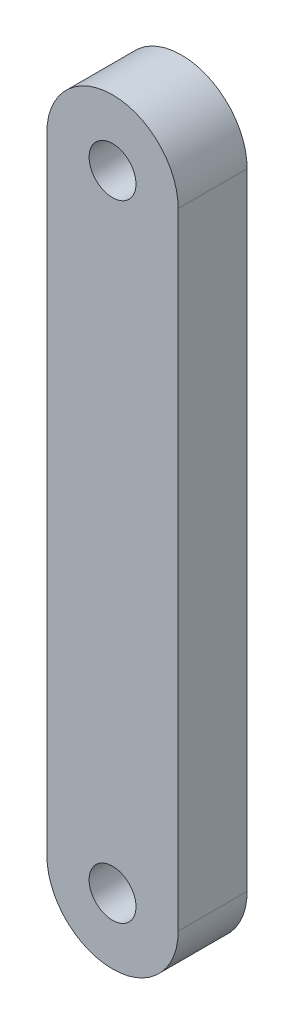
ISO-10303-21;
HEADER;
FILE_DESCRIPTION(('STEP AP214'),'2;1');
FILE_NAME('part.step','',(''),(''),'','','');
FILE_SCHEMA(('AUTOMOTIVE_DESIGN { 1 0 10303 214 1 1 1 1 }'));
ENDSEC;
DATA;
#1=APPLICATION_CONTEXT('core data for automotive mechanical design processes');
#2=APPLICATION_PROTOCOL_DEFINITION('international standard','automotive_design',2000,#1);
#3=PRODUCT_CONTEXT('',#1,'mechanical');
#4=PRODUCT('Part','Part','',(#3));
#5=PRODUCT_RELATED_PRODUCT_CATEGORY('part','',(#4));
#6=PRODUCT_DEFINITION_FORMATION('','',#4);
#7=PRODUCT_DEFINITION_CONTEXT('part definition',#1,'design');
#8=PRODUCT_DEFINITION('design','',#6,#7);
#9=PRODUCT_DEFINITION_SHAPE('','',#8);
#10=(LENGTH_UNIT() NAMED_UNIT(*) SI_UNIT(.MILLI.,.METRE.));
#11=(NAMED_UNIT(*) PLANE_ANGLE_UNIT() SI_UNIT($,.RADIAN.));
#12=(NAMED_UNIT(*) SI_UNIT($,.STERADIAN.) SOLID_ANGLE_UNIT());
#13=UNCERTAINTY_MEASURE_WITH_UNIT(LENGTH_MEASURE(1.E-05),#10,'distance_accuracy_value','');
#14=(GEOMETRIC_REPRESENTATION_CONTEXT(3) GLOBAL_UNCERTAINTY_ASSIGNED_CONTEXT((#13)) GLOBAL_UNIT_ASSIGNED_CONTEXT((#10,
#11,#12)) REPRESENTATION_CONTEXT('',''));
#15=CARTESIAN_POINT('',(0.,0.,0.));
#16=DIRECTION('',(0.,0.,1.));
#17=DIRECTION('',(1.,0.,0.));
#18=AXIS2_PLACEMENT_3D('',#15,#16,#17);
#19=CARTESIAN_POINT('',(0.,14.4838985534079,5.));
#20=DIRECTION('',(0.,0.,1.));
#21=DIRECTION('',(1.,0.,0.));
#22=AXIS2_PLACEMENT_3D('',#19,#20,#21);
#23=PLANE('',#22);
#24=CARTESIAN_POINT('',(0.,59.8656683806735,5.));
#25=DIRECTION('',(0.,0.,1.));
#26=DIRECTION('',(1.,0.,0.));
#27=AXIS2_PLACEMENT_3D('',#24,#25,#26);
#28=CIRCLE('',#27,1.7);
#29=CARTESIAN_POINT('',(1.7,59.8656683806735,5.));
#30=VERTEX_POINT('',#29);
#31=EDGE_CURVE('E121',#30,#30,#28,.T.);
#32=ORIENTED_EDGE('',*,*,#31,.F.);
#33=EDGE_LOOP('',(#32));
#34=FACE_BOUND('',#33,.T.);
#35=CARTESIAN_POINT('',(0.,14.4838985534079,5.));
#36=DIRECTION('',(0.,0.,1.));
#37=DIRECTION('',(1.,0.,0.));
#38=AXIS2_PLACEMENT_3D('',#35,#36,#37);
#39=CIRCLE('',#38,4.7623156527834);
#40=CARTESIAN_POINT('',(-4.7623156527834,14.4838985534079,5.));
#41=VERTEX_POINT('',#40);
#42=CARTESIAN_POINT('',(4.7623156527834,14.4838985534079,5.));
#43=VERTEX_POINT('',#42);
#44=EDGE_CURVE('E100',#41,#43,#39,.T.);
#45=ORIENTED_EDGE('',*,*,#44,.T.);
#46=DIRECTION('',(0.,1.,0.));
#47=VECTOR('',#46,1.);
#48=CARTESIAN_POINT('',(4.7623156527834,14.4838985534079,5.));
#49=LINE('',#48,#47);
#50=CARTESIAN_POINT('',(4.7623156527834,59.8656683806735,5.));
#51=VERTEX_POINT('',#50);
#52=EDGE_CURVE('E94',#43,#51,#49,.T.);
#53=ORIENTED_EDGE('',*,*,#52,.T.);
#54=CARTESIAN_POINT('',(0.,59.8656683806735,5.));
#55=DIRECTION('',(0.,0.,1.));
#56=DIRECTION('',(1.,0.,0.));
#57=AXIS2_PLACEMENT_3D('',#54,#55,#56);
#58=CIRCLE('',#57,4.7623156527834);
#59=CARTESIAN_POINT('',(-4.7623156527834,59.8656683806735,5.));
#60=VERTEX_POINT('',#59);
#61=EDGE_CURVE('E98',#51,#60,#58,.T.);
#62=ORIENTED_EDGE('',*,*,#61,.T.);
#63=DIRECTION('',(0.,-1.,0.));
#64=VECTOR('',#63,1.);
#65=CARTESIAN_POINT('',(-4.7623156527834,14.4838985534079,5.));
#66=LINE('',#65,#64);
#67=EDGE_CURVE('E60',#60,#41,#66,.T.);
#68=ORIENTED_EDGE('',*,*,#67,.T.);
#69=EDGE_LOOP('',(#45,#53,#62,#68));
#70=FACE_BOUND('',#69,.T.);
#71=CARTESIAN_POINT('',(0.,14.4838985534079,5.));
#72=DIRECTION('',(0.,0.,1.));
#73=DIRECTION('',(1.,0.,0.));
#74=AXIS2_PLACEMENT_3D('',#71,#72,#73);
#75=CIRCLE('',#74,1.7);
#76=CARTESIAN_POINT('',(1.7,14.4838985534079,5.));
#77=VERTEX_POINT('',#76);
#78=EDGE_CURVE('E143',#77,#77,#75,.T.);
#79=ORIENTED_EDGE('',*,*,#78,.F.);
#80=EDGE_LOOP('',(#79));
#81=FACE_BOUND('',#80,.T.);
#82=ADVANCED_FACE('F39',(#34,#70,#81),#23,.T.);
#83=CARTESIAN_POINT('',(0.,14.4838985534079,0.));
#84=DIRECTION('',(0.,0.,1.));
#85=DIRECTION('',(1.,0.,0.));
#86=AXIS2_PLACEMENT_3D('',#83,#84,#85);
#87=PLANE('',#86);
#88=CARTESIAN_POINT('',(0.,59.8656683806735,0.));
#89=DIRECTION('',(0.,0.,1.));
#90=DIRECTION('',(1.,0.,0.));
#91=AXIS2_PLACEMENT_3D('',#88,#89,#90);
#92=CIRCLE('',#91,1.7);
#93=CARTESIAN_POINT('',(1.7,59.8656683806735,0.));
#94=VERTEX_POINT('',#93);
#95=EDGE_CURVE('E140',#94,#94,#92,.T.);
#96=ORIENTED_EDGE('',*,*,#95,.T.);
#97=EDGE_LOOP('',(#96));
#98=FACE_BOUND('',#97,.T.);
#99=CARTESIAN_POINT('',(0.,14.4838985534079,0.));
#100=DIRECTION('',(0.,0.,1.));
#101=DIRECTION('',(1.,0.,0.));
#102=AXIS2_PLACEMENT_3D('',#99,#100,#101);
#103=CIRCLE('',#102,4.7623156527834);
#104=CARTESIAN_POINT('',(-4.7623156527834,14.4838985534079,0.));
#105=VERTEX_POINT('',#104);
#106=CARTESIAN_POINT('',(4.7623156527834,14.4838985534079,0.));
#107=VERTEX_POINT('',#106);
#108=EDGE_CURVE('E117',#105,#107,#103,.T.);
#109=ORIENTED_EDGE('',*,*,#108,.F.);
#110=DIRECTION('',(0.,-1.,0.));
#111=VECTOR('',#110,1.);
#112=CARTESIAN_POINT('',(-4.7623156527834,14.4838985534079,0.));
#113=LINE('',#112,#111);
#114=CARTESIAN_POINT('',(-4.7623156527834,59.8656683806735,0.));
#115=VERTEX_POINT('',#114);
#116=EDGE_CURVE('E87',#115,#105,#113,.T.);
#117=ORIENTED_EDGE('',*,*,#116,.F.);
#118=CARTESIAN_POINT('',(0.,59.8656683806735,0.));
#119=DIRECTION('',(0.,0.,1.));
#120=DIRECTION('',(1.,0.,0.));
#121=AXIS2_PLACEMENT_3D('',#118,#119,#120);
#122=CIRCLE('',#121,4.7623156527834);
#123=CARTESIAN_POINT('',(4.7623156527834,59.8656683806735,0.));
#124=VERTEX_POINT('',#123);
#125=EDGE_CURVE('E81',#124,#115,#122,.T.);
#126=ORIENTED_EDGE('',*,*,#125,.F.);
#127=DIRECTION('',(0.,1.,0.));
#128=VECTOR('',#127,1.);
#129=CARTESIAN_POINT('',(4.7623156527834,14.4838985534079,0.));
#130=LINE('',#129,#128);
#131=EDGE_CURVE('E105',#107,#124,#130,.T.);
#132=ORIENTED_EDGE('',*,*,#131,.F.);
#133=EDGE_LOOP('',(#109,#117,#126,#132));
#134=FACE_BOUND('',#133,.T.);
#135=CARTESIAN_POINT('',(0.,14.4838985534079,0.));
#136=DIRECTION('',(0.,0.,1.));
#137=DIRECTION('',(1.,0.,0.));
#138=AXIS2_PLACEMENT_3D('',#135,#136,#137);
#139=CIRCLE('',#138,1.7);
#140=CARTESIAN_POINT('',(1.7,14.4838985534079,0.));
#141=VERTEX_POINT('',#140);
#142=EDGE_CURVE('E147',#141,#141,#139,.T.);
#143=ORIENTED_EDGE('',*,*,#142,.T.);
#144=EDGE_LOOP('',(#143));
#145=FACE_BOUND('',#144,.T.);
#146=ADVANCED_FACE('F134',(#98,#134,#145),#87,.F.);
#147=CARTESIAN_POINT('',(0.,14.4838985534079,5.));
#148=DIRECTION('',(0.,0.,-1.));
#149=DIRECTION('',(-1.,0.,0.));
#150=AXIS2_PLACEMENT_3D('',#147,#148,#149);
#151=CYLINDRICAL_SURFACE('',#150,4.7623156527834);
#152=ORIENTED_EDGE('',*,*,#108,.T.);
#153=DIRECTION('',(0.,0.,-1.));
#154=VECTOR('',#153,1.);
#155=CARTESIAN_POINT('',(4.7623156527834,14.4838985534079,5.));
#156=LINE('',#155,#154);
#157=EDGE_CURVE('E11',#43,#107,#156,.T.);
#158=ORIENTED_EDGE('',*,*,#157,.F.);
#159=ORIENTED_EDGE('',*,*,#44,.F.);
#160=DIRECTION('',(0.,0.,-1.));
#161=VECTOR('',#160,1.);
#162=CARTESIAN_POINT('',(-4.7623156527834,14.4838985534079,5.));
#163=LINE('',#162,#161);
#164=EDGE_CURVE('E113',#41,#105,#163,.T.);
#165=ORIENTED_EDGE('',*,*,#164,.T.);
#166=EDGE_LOOP('',(#152,#158,#159,#165));
#167=FACE_BOUND('',#166,.T.);
#168=ADVANCED_FACE('F41',(#167),#151,.T.);
#169=CARTESIAN_POINT('',(4.7623156527834,14.4838985534079,5.));
#170=DIRECTION('',(-1.,0.,0.));
#171=DIRECTION('',(0.,0.,1.));
#172=AXIS2_PLACEMENT_3D('',#169,#170,#171);
#173=PLANE('',#172);
#174=ORIENTED_EDGE('',*,*,#131,.T.);
#175=DIRECTION('',(0.,0.,-1.));
#176=VECTOR('',#175,1.);
#177=CARTESIAN_POINT('',(4.7623156527834,59.8656683806735,5.));
#178=LINE('',#177,#176);
#179=EDGE_CURVE('E49',#51,#124,#178,.T.);
#180=ORIENTED_EDGE('',*,*,#179,.F.);
#181=ORIENTED_EDGE('',*,*,#52,.F.);
#182=ORIENTED_EDGE('',*,*,#157,.T.);
#183=EDGE_LOOP('',(#174,#180,#181,#182));
#184=FACE_BOUND('',#183,.T.);
#185=ADVANCED_FACE('F104',(#184),#173,.F.);
#186=CARTESIAN_POINT('',(0.,59.8656683806735,5.));
#187=DIRECTION('',(0.,0.,-1.));
#188=DIRECTION('',(-1.,0.,0.));
#189=AXIS2_PLACEMENT_3D('',#186,#187,#188);
#190=CYLINDRICAL_SURFACE('',#189,4.7623156527834);
#191=ORIENTED_EDGE('',*,*,#125,.T.);
#192=DIRECTION('',(0.,0.,-1.));
#193=VECTOR('',#192,1.);
#194=CARTESIAN_POINT('',(-4.7623156527834,59.8656683806735,5.));
#195=LINE('',#194,#193);
#196=EDGE_CURVE('E107',#60,#115,#195,.T.);
#197=ORIENTED_EDGE('',*,*,#196,.F.);
#198=ORIENTED_EDGE('',*,*,#61,.F.);
#199=ORIENTED_EDGE('',*,*,#179,.T.);
#200=EDGE_LOOP('',(#191,#197,#198,#199));
#201=FACE_BOUND('',#200,.T.);
#202=ADVANCED_FACE('F108',(#201),#190,.T.);
#203=CARTESIAN_POINT('',(-4.7623156527834,14.4838985534079,5.));
#204=DIRECTION('',(1.,0.,0.));
#205=DIRECTION('',(0.,0.,-1.));
#206=AXIS2_PLACEMENT_3D('',#203,#204,#205);
#207=PLANE('',#206);
#208=ORIENTED_EDGE('',*,*,#116,.T.);
#209=ORIENTED_EDGE('',*,*,#164,.F.);
#210=ORIENTED_EDGE('',*,*,#67,.F.);
#211=ORIENTED_EDGE('',*,*,#196,.T.);
#212=EDGE_LOOP('',(#208,#209,#210,#211));
#213=FACE_BOUND('',#212,.T.);
#214=ADVANCED_FACE('F131',(#213),#207,.F.);
#215=CARTESIAN_POINT('',(0.,59.8656683806735,5.));
#216=DIRECTION('',(0.,0.,-1.));
#217=DIRECTION('',(-1.,0.,0.));
#218=AXIS2_PLACEMENT_3D('',#215,#216,#217);
#219=CYLINDRICAL_SURFACE('',#218,1.7);
#220=ORIENTED_EDGE('',*,*,#31,.T.);
#221=EDGE_LOOP('',(#220));
#222=FACE_BOUND('',#221,.T.);
#223=ORIENTED_EDGE('',*,*,#95,.F.);
#224=EDGE_LOOP('',(#223));
#225=FACE_BOUND('',#224,.T.);
#226=ADVANCED_FACE('F166',(#222,#225),#219,.F.);
#227=CARTESIAN_POINT('',(0.,14.4838985534079,5.));
#228=DIRECTION('',(0.,0.,-1.));
#229=DIRECTION('',(-1.,0.,0.));
#230=AXIS2_PLACEMENT_3D('',#227,#228,#229);
#231=CYLINDRICAL_SURFACE('',#230,1.7);
#232=ORIENTED_EDGE('',*,*,#78,.T.);
#233=EDGE_LOOP('',(#232));
#234=FACE_BOUND('',#233,.T.);
#235=ORIENTED_EDGE('',*,*,#142,.F.);
#236=EDGE_LOOP('',(#235));
#237=FACE_BOUND('',#236,.T.);
#238=ADVANCED_FACE('F154',(#234,#237),#231,.F.);
#239=CLOSED_SHELL('',(#82,#146,#168,#185,#202,#214,#226,#238));
#240=MANIFOLD_SOLID_BREP('B2',#239);
#241=ADVANCED_BREP_SHAPE_REPRESENTATION('',(#18,#240),#14);
#242=SHAPE_DEFINITION_REPRESENTATION(#9,#241);
ENDSEC;
END-ISO-10303-21;
